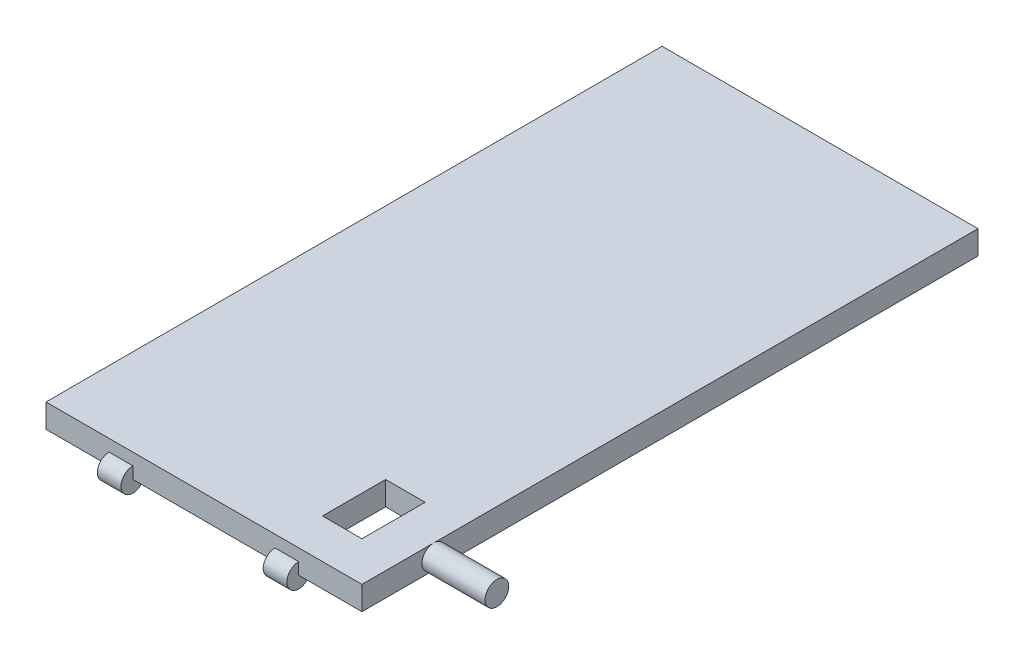
ISO-10303-21;
HEADER;
FILE_DESCRIPTION(('STEP AP214'),'2;1');
FILE_NAME('part.step','',(''),(''),'','','');
FILE_SCHEMA(('AUTOMOTIVE_DESIGN { 1 0 10303 214 1 1 1 1 }'));
ENDSEC;
DATA;
#1=APPLICATION_CONTEXT('core data for automotive mechanical design processes');
#2=APPLICATION_PROTOCOL_DEFINITION('international standard','automotive_design',2000,#1);
#3=PRODUCT_CONTEXT('',#1,'mechanical');
#4=PRODUCT('Part','Part','',(#3));
#5=PRODUCT_RELATED_PRODUCT_CATEGORY('part','',(#4));
#6=PRODUCT_DEFINITION_FORMATION('','',#4);
#7=PRODUCT_DEFINITION_CONTEXT('part definition',#1,'design');
#8=PRODUCT_DEFINITION('design','',#6,#7);
#9=PRODUCT_DEFINITION_SHAPE('','',#8);
#10=(LENGTH_UNIT() NAMED_UNIT(*) SI_UNIT(.MILLI.,.METRE.));
#11=(NAMED_UNIT(*) PLANE_ANGLE_UNIT() SI_UNIT($,.RADIAN.));
#12=(NAMED_UNIT(*) SI_UNIT($,.STERADIAN.) SOLID_ANGLE_UNIT());
#13=UNCERTAINTY_MEASURE_WITH_UNIT(LENGTH_MEASURE(1.E-05),#10,'distance_accuracy_value','');
#14=(GEOMETRIC_REPRESENTATION_CONTEXT(3) GLOBAL_UNCERTAINTY_ASSIGNED_CONTEXT((#13)) GLOBAL_UNIT_ASSIGNED_CONTEXT((#10,
#11,#12)) REPRESENTATION_CONTEXT('',''));
#15=CARTESIAN_POINT('',(0.,0.,0.));
#16=DIRECTION('',(0.,0.,1.));
#17=DIRECTION('',(1.,0.,0.));
#18=AXIS2_PLACEMENT_3D('',#15,#16,#17);
#19=CARTESIAN_POINT('',(40.,3.,0.));
#20=DIRECTION('',(-1.,0.,0.));
#21=DIRECTION('',(0.,0.,1.));
#22=AXIS2_PLACEMENT_3D('',#19,#20,#21);
#23=PLANE('',#22);
#24=CARTESIAN_POINT('',(40.,1.5,-9.09));
#25=DIRECTION('',(1.,0.,0.));
#26=DIRECTION('',(0.,0.,-1.));
#27=AXIS2_PLACEMENT_3D('',#24,#25,#26);
#28=CIRCLE('',#27,1.5);
#29=CARTESIAN_POINT('',(40.,3.,-9.09));
#30=VERTEX_POINT('',#29);
#31=CARTESIAN_POINT('',(40.,0.,-9.09));
#32=VERTEX_POINT('',#31);
#33=EDGE_CURVE('E43',#30,#32,#28,.T.);
#34=ORIENTED_EDGE('',*,*,#33,.F.);
#35=DIRECTION('',(0.,0.,-1.));
#36=VECTOR('',#35,1.);
#37=CARTESIAN_POINT('',(40.,3.,0.));
#38=LINE('',#37,#36);
#39=CARTESIAN_POINT('',(40.,3.,0.));
#40=VERTEX_POINT('',#39);
#41=EDGE_CURVE('E217',#40,#30,#38,.T.);
#42=ORIENTED_EDGE('',*,*,#41,.F.);
#43=DIRECTION('',(0.,-1.,0.));
#44=VECTOR('',#43,1.);
#45=CARTESIAN_POINT('',(40.,3.,0.));
#46=LINE('',#45,#44);
#47=CARTESIAN_POINT('',(40.,0.,0.));
#48=VERTEX_POINT('',#47);
#49=EDGE_CURVE('E239',#40,#48,#46,.T.);
#50=ORIENTED_EDGE('',*,*,#49,.T.);
#51=DIRECTION('',(0.,0.,-1.));
#52=VECTOR('',#51,1.);
#53=CARTESIAN_POINT('',(40.,0.,0.));
#54=LINE('',#53,#52);
#55=EDGE_CURVE('E230',#48,#32,#54,.T.);
#56=ORIENTED_EDGE('',*,*,#55,.T.);
#57=EDGE_LOOP('',(#34,#42,#50,#56));
#58=FACE_BOUND('',#57,.T.);
#59=ADVANCED_FACE('F33',(#58),#23,.F.);
#60=CARTESIAN_POINT('',(0.,3.,0.));
#61=DIRECTION('',(0.,0.,-1.));
#62=DIRECTION('',(-1.,0.,0.));
#63=AXIS2_PLACEMENT_3D('',#60,#61,#62);
#64=PLANE('',#63);
#65=DIRECTION('',(0.,-1.,0.));
#66=VECTOR('',#65,1.);
#67=CARTESIAN_POINT('',(8.,3.,0.));
#68=LINE('',#67,#66);
#69=CARTESIAN_POINT('',(8.,1.5,0.));
#70=VERTEX_POINT('',#69);
#71=CARTESIAN_POINT('',(8.,0.,0.));
#72=VERTEX_POINT('',#71);
#73=EDGE_CURVE('E190',#70,#72,#68,.T.);
#74=ORIENTED_EDGE('',*,*,#73,.F.);
#75=DIRECTION('',(1.,0.,0.));
#76=VECTOR('',#75,1.);
#77=CARTESIAN_POINT('',(8.,1.5,0.));
#78=LINE('',#77,#76);
#79=CARTESIAN_POINT('',(11.,1.5,0.));
#80=VERTEX_POINT('',#79);
#81=EDGE_CURVE('E193',#70,#80,#78,.T.);
#82=ORIENTED_EDGE('',*,*,#81,.T.);
#83=DIRECTION('',(0.,-1.,0.));
#84=VECTOR('',#83,1.);
#85=CARTESIAN_POINT('',(11.,3.,0.));
#86=LINE('',#85,#84);
#87=CARTESIAN_POINT('',(11.,0.,0.));
#88=VERTEX_POINT('',#87);
#89=EDGE_CURVE('E185',#80,#88,#86,.T.);
#90=ORIENTED_EDGE('',*,*,#89,.T.);
#91=DIRECTION('',(1.,0.,0.));
#92=VECTOR('',#91,1.);
#93=CARTESIAN_POINT('',(0.,0.,0.));
#94=LINE('',#93,#92);
#95=CARTESIAN_POINT('',(29.,0.,0.));
#96=VERTEX_POINT('',#95);
#97=EDGE_CURVE('E229',#88,#96,#94,.T.);
#98=ORIENTED_EDGE('',*,*,#97,.T.);
#99=DIRECTION('',(0.,-1.,0.));
#100=VECTOR('',#99,1.);
#101=CARTESIAN_POINT('',(29.,3.,0.));
#102=LINE('',#101,#100);
#103=CARTESIAN_POINT('',(29.,1.5,0.));
#104=VERTEX_POINT('',#103);
#105=EDGE_CURVE('E204',#104,#96,#102,.T.);
#106=ORIENTED_EDGE('',*,*,#105,.F.);
#107=DIRECTION('',(1.,0.,0.));
#108=VECTOR('',#107,1.);
#109=CARTESIAN_POINT('',(29.,1.5,0.));
#110=LINE('',#109,#108);
#111=CARTESIAN_POINT('',(32.,1.5,0.));
#112=VERTEX_POINT('',#111);
#113=EDGE_CURVE('E207',#104,#112,#110,.T.);
#114=ORIENTED_EDGE('',*,*,#113,.T.);
#115=DIRECTION('',(0.,-1.,0.));
#116=VECTOR('',#115,1.);
#117=CARTESIAN_POINT('',(32.,3.,0.));
#118=LINE('',#117,#116);
#119=CARTESIAN_POINT('',(32.,0.,0.));
#120=VERTEX_POINT('',#119);
#121=EDGE_CURVE('E199',#112,#120,#118,.T.);
#122=ORIENTED_EDGE('',*,*,#121,.T.);
#123=EDGE_CURVE('E224',#120,#48,#94,.T.);
#124=ORIENTED_EDGE('',*,*,#123,.T.);
#125=ORIENTED_EDGE('',*,*,#49,.F.);
#126=DIRECTION('',(1.,0.,0.));
#127=VECTOR('',#126,1.);
#128=CARTESIAN_POINT('',(0.,3.,0.));
#129=LINE('',#128,#127);
#130=CARTESIAN_POINT('',(0.,3.,0.));
#131=VERTEX_POINT('',#130);
#132=EDGE_CURVE('E213',#131,#40,#129,.T.);
#133=ORIENTED_EDGE('',*,*,#132,.F.);
#134=DIRECTION('',(0.,-1.,0.));
#135=VECTOR('',#134,1.);
#136=CARTESIAN_POINT('',(0.,3.,0.));
#137=LINE('',#136,#135);
#138=CARTESIAN_POINT('',(0.,0.,0.));
#139=VERTEX_POINT('',#138);
#140=EDGE_CURVE('E242',#131,#139,#137,.T.);
#141=ORIENTED_EDGE('',*,*,#140,.T.);
#142=EDGE_CURVE('E225',#139,#72,#94,.T.);
#143=ORIENTED_EDGE('',*,*,#142,.T.);
#144=EDGE_LOOP('',(#74,#82,#90,#98,#106,#114,#122,#124,#125,#133,#141,#143));
#145=FACE_BOUND('',#144,.T.);
#146=ADVANCED_FACE('F267',(#145),#64,.F.);
#147=CARTESIAN_POINT('',(0.,0.,0.));
#148=DIRECTION('',(0.,-1.,0.));
#149=DIRECTION('',(0.,0.,-1.));
#150=AXIS2_PLACEMENT_3D('',#147,#148,#149);
#151=PLANE('',#150);
#152=DIRECTION('',(0.,0.,1.));
#153=VECTOR('',#152,1.);
#154=CARTESIAN_POINT('',(35.,0.,0.));
#155=LINE('',#154,#153);
#156=CARTESIAN_POINT('',(35.,0.,-13.));
#157=VERTEX_POINT('',#156);
#158=CARTESIAN_POINT('',(35.,0.,-5.));
#159=VERTEX_POINT('',#158);
#160=EDGE_CURVE('E175',#157,#159,#155,.T.);
#161=ORIENTED_EDGE('',*,*,#160,.F.);
#162=DIRECTION('',(1.,0.,0.));
#163=VECTOR('',#162,1.);
#164=CARTESIAN_POINT('',(0.,0.,-13.));
#165=LINE('',#164,#163);
#166=CARTESIAN_POINT('',(30.,0.,-13.));
#167=VERTEX_POINT('',#166);
#168=EDGE_CURVE('E168',#167,#157,#165,.T.);
#169=ORIENTED_EDGE('',*,*,#168,.F.);
#170=DIRECTION('',(0.,0.,-1.));
#171=VECTOR('',#170,1.);
#172=CARTESIAN_POINT('',(30.,0.,0.));
#173=LINE('',#172,#171);
#174=CARTESIAN_POINT('',(30.,0.,-5.));
#175=VERTEX_POINT('',#174);
#176=EDGE_CURVE('E148',#175,#167,#173,.T.);
#177=ORIENTED_EDGE('',*,*,#176,.F.);
#178=DIRECTION('',(-1.,0.,0.));
#179=VECTOR('',#178,1.);
#180=CARTESIAN_POINT('',(0.,0.,-4.99999999999999));
#181=LINE('',#180,#179);
#182=EDGE_CURVE('E173',#159,#175,#181,.T.);
#183=ORIENTED_EDGE('',*,*,#182,.F.);
#184=EDGE_LOOP('',(#161,#169,#177,#183));
#185=FACE_BOUND('',#184,.T.);
#186=DIRECTION('',(1.,0.,0.));
#187=VECTOR('',#186,1.);
#188=CARTESIAN_POINT('',(8.,0.,-1.5));
#189=LINE('',#188,#187);
#190=CARTESIAN_POINT('',(8.,0.,-1.5));
#191=VERTEX_POINT('',#190);
#192=CARTESIAN_POINT('',(11.,0.,-1.5));
#193=VERTEX_POINT('',#192);
#194=EDGE_CURVE('E256',#191,#193,#189,.T.);
#195=ORIENTED_EDGE('',*,*,#194,.F.);
#196=DIRECTION('',(0.,0.,1.));
#197=VECTOR('',#196,1.);
#198=CARTESIAN_POINT('',(8.,0.,0.));
#199=LINE('',#198,#197);
#200=EDGE_CURVE('E37',#191,#72,#199,.T.);
#201=ORIENTED_EDGE('',*,*,#200,.T.);
#202=ORIENTED_EDGE('',*,*,#142,.F.);
#203=DIRECTION('',(0.,0.,1.));
#204=VECTOR('',#203,1.);
#205=CARTESIAN_POINT('',(0.,0.,0.));
#206=LINE('',#205,#204);
#207=CARTESIAN_POINT('',(0.,0.,-78.));
#208=VERTEX_POINT('',#207);
#209=EDGE_CURVE('E209',#208,#139,#206,.T.);
#210=ORIENTED_EDGE('',*,*,#209,.F.);
#211=DIRECTION('',(-1.,0.,0.));
#212=VECTOR('',#211,1.);
#213=CARTESIAN_POINT('',(0.,0.,-78.));
#214=LINE('',#213,#212);
#215=CARTESIAN_POINT('',(40.,0.,-78.));
#216=VERTEX_POINT('',#215);
#217=EDGE_CURVE('E214',#216,#208,#214,.T.);
#218=ORIENTED_EDGE('',*,*,#217,.F.);
#219=EDGE_CURVE('E228',#32,#216,#54,.T.);
#220=ORIENTED_EDGE('',*,*,#219,.F.);
#221=ORIENTED_EDGE('',*,*,#55,.F.);
#222=ORIENTED_EDGE('',*,*,#123,.F.);
#223=DIRECTION('',(0.,0.,1.));
#224=VECTOR('',#223,1.);
#225=CARTESIAN_POINT('',(32.,0.,0.));
#226=LINE('',#225,#224);
#227=CARTESIAN_POINT('',(32.,0.,-1.5));
#228=VERTEX_POINT('',#227);
#229=EDGE_CURVE('E245',#228,#120,#226,.T.);
#230=ORIENTED_EDGE('',*,*,#229,.F.);
#231=DIRECTION('',(1.,0.,0.));
#232=VECTOR('',#231,1.);
#233=CARTESIAN_POINT('',(29.,0.,-1.5));
#234=LINE('',#233,#232);
#235=CARTESIAN_POINT('',(29.,0.,-1.5));
#236=VERTEX_POINT('',#235);
#237=EDGE_CURVE('E248',#236,#228,#234,.T.);
#238=ORIENTED_EDGE('',*,*,#237,.F.);
#239=DIRECTION('',(0.,0.,1.));
#240=VECTOR('',#239,1.);
#241=CARTESIAN_POINT('',(29.,0.,0.));
#242=LINE('',#241,#240);
#243=EDGE_CURVE('E251',#236,#96,#242,.T.);
#244=ORIENTED_EDGE('',*,*,#243,.T.);
#245=ORIENTED_EDGE('',*,*,#97,.F.);
#246=DIRECTION('',(0.,0.,1.));
#247=VECTOR('',#246,1.);
#248=CARTESIAN_POINT('',(11.,0.,0.));
#249=LINE('',#248,#247);
#250=EDGE_CURVE('E254',#193,#88,#249,.T.);
#251=ORIENTED_EDGE('',*,*,#250,.F.);
#252=EDGE_LOOP('',(#195,#201,#202,#210,#218,#220,#221,#222,#230,#238,#244,#245,#251));
#253=FACE_BOUND('',#252,.T.);
#254=ADVANCED_FACE('F262',(#185,#253),#151,.T.);
#255=CARTESIAN_POINT('',(0.,3.,0.));
#256=DIRECTION('',(1.,0.,0.));
#257=DIRECTION('',(0.,0.,-1.));
#258=AXIS2_PLACEMENT_3D('',#255,#256,#257);
#259=PLANE('',#258);
#260=ORIENTED_EDGE('',*,*,#209,.T.);
#261=ORIENTED_EDGE('',*,*,#140,.F.);
#262=DIRECTION('',(0.,0.,1.));
#263=VECTOR('',#262,1.);
#264=CARTESIAN_POINT('',(0.,3.,0.));
#265=LINE('',#264,#263);
#266=CARTESIAN_POINT('',(0.,3.,-78.));
#267=VERTEX_POINT('',#266);
#268=EDGE_CURVE('E210',#267,#131,#265,.T.);
#269=ORIENTED_EDGE('',*,*,#268,.F.);
#270=DIRECTION('',(0.,-1.,0.));
#271=VECTOR('',#270,1.);
#272=CARTESIAN_POINT('',(0.,3.,-78.));
#273=LINE('',#272,#271);
#274=EDGE_CURVE('E221',#267,#208,#273,.T.);
#275=ORIENTED_EDGE('',*,*,#274,.T.);
#276=EDGE_LOOP('',(#260,#261,#269,#275));
#277=FACE_BOUND('',#276,.T.);
#278=ADVANCED_FACE('F35',(#277),#259,.F.);
#279=EDGE_CURVE('E11',#32,#30,#28,.T.);
#280=ORIENTED_EDGE('',*,*,#279,.F.);
#281=ORIENTED_EDGE('',*,*,#219,.T.);
#282=DIRECTION('',(0.,-1.,0.));
#283=VECTOR('',#282,1.);
#284=CARTESIAN_POINT('',(40.,3.,-78.));
#285=LINE('',#284,#283);
#286=CARTESIAN_POINT('',(40.,3.,-78.));
#287=VERTEX_POINT('',#286);
#288=EDGE_CURVE('E236',#287,#216,#285,.T.);
#289=ORIENTED_EDGE('',*,*,#288,.F.);
#290=EDGE_CURVE('E216',#30,#287,#38,.T.);
#291=ORIENTED_EDGE('',*,*,#290,.F.);
#292=EDGE_LOOP('',(#280,#281,#289,#291));
#293=FACE_BOUND('',#292,.T.);
#294=ADVANCED_FACE('F286',(#293),#23,.F.);
#295=CARTESIAN_POINT('',(0.,3.,-78.));
#296=DIRECTION('',(0.,0.,1.));
#297=DIRECTION('',(1.,0.,0.));
#298=AXIS2_PLACEMENT_3D('',#295,#296,#297);
#299=PLANE('',#298);
#300=ORIENTED_EDGE('',*,*,#217,.T.);
#301=ORIENTED_EDGE('',*,*,#274,.F.);
#302=DIRECTION('',(-1.,0.,0.));
#303=VECTOR('',#302,1.);
#304=CARTESIAN_POINT('',(0.,3.,-78.));
#305=LINE('',#304,#303);
#306=EDGE_CURVE('E219',#287,#267,#305,.T.);
#307=ORIENTED_EDGE('',*,*,#306,.F.);
#308=ORIENTED_EDGE('',*,*,#288,.T.);
#309=EDGE_LOOP('',(#300,#301,#307,#308));
#310=FACE_BOUND('',#309,.T.);
#311=ADVANCED_FACE('F290',(#310),#299,.F.);
#312=CARTESIAN_POINT('',(0.,3.,0.));
#313=DIRECTION('',(0.,-1.,0.));
#314=DIRECTION('',(0.,0.,-1.));
#315=AXIS2_PLACEMENT_3D('',#312,#313,#314);
#316=PLANE('',#315);
#317=DIRECTION('',(-1.,0.,0.));
#318=VECTOR('',#317,1.);
#319=CARTESIAN_POINT('',(35.,3.,-13.));
#320=LINE('',#319,#318);
#321=CARTESIAN_POINT('',(35.,3.,-13.));
#322=VERTEX_POINT('',#321);
#323=CARTESIAN_POINT('',(30.,3.,-13.));
#324=VERTEX_POINT('',#323);
#325=EDGE_CURVE('E154',#322,#324,#320,.T.);
#326=ORIENTED_EDGE('',*,*,#325,.F.);
#327=DIRECTION('',(0.,0.,-1.));
#328=VECTOR('',#327,1.);
#329=CARTESIAN_POINT('',(35.,3.,-5.));
#330=LINE('',#329,#328);
#331=CARTESIAN_POINT('',(35.,3.,-5.));
#332=VERTEX_POINT('',#331);
#333=EDGE_CURVE('E58',#332,#322,#330,.T.);
#334=ORIENTED_EDGE('',*,*,#333,.F.);
#335=DIRECTION('',(1.,0.,0.));
#336=VECTOR('',#335,1.);
#337=CARTESIAN_POINT('',(35.,3.,-5.));
#338=LINE('',#337,#336);
#339=CARTESIAN_POINT('',(30.,3.,-5.));
#340=VERTEX_POINT('',#339);
#341=EDGE_CURVE('E161',#340,#332,#338,.T.);
#342=ORIENTED_EDGE('',*,*,#341,.F.);
#343=DIRECTION('',(0.,0.,1.));
#344=VECTOR('',#343,1.);
#345=CARTESIAN_POINT('',(30.,3.,-5.));
#346=LINE('',#345,#344);
#347=EDGE_CURVE('E145',#324,#340,#346,.T.);
#348=ORIENTED_EDGE('',*,*,#347,.F.);
#349=EDGE_LOOP('',(#326,#334,#342,#348));
#350=FACE_BOUND('',#349,.T.);
#351=ORIENTED_EDGE('',*,*,#268,.T.);
#352=ORIENTED_EDGE('',*,*,#132,.T.);
#353=ORIENTED_EDGE('',*,*,#41,.T.);
#354=ORIENTED_EDGE('',*,*,#290,.T.);
#355=ORIENTED_EDGE('',*,*,#306,.T.);
#356=EDGE_LOOP('',(#351,#352,#353,#354,#355));
#357=FACE_BOUND('',#356,.T.);
#358=ADVANCED_FACE('F158',(#350,#357),#316,.F.);
#359=CARTESIAN_POINT('',(29.,0.,0.));
#360=DIRECTION('',(1.,0.,0.));
#361=DIRECTION('',(0.,0.,-1.));
#362=AXIS2_PLACEMENT_3D('',#359,#360,#361);
#363=CYLINDRICAL_SURFACE('',#362,1.5);
#364=ORIENTED_EDGE('',*,*,#113,.F.);
#365=CARTESIAN_POINT('',(29.,0.,0.));
#366=DIRECTION('',(1.,0.,0.));
#367=DIRECTION('',(0.,0.,-1.));
#368=AXIS2_PLACEMENT_3D('',#365,#366,#367);
#369=CIRCLE('',#368,1.5);
#370=EDGE_CURVE('E196',#104,#236,#369,.T.);
#371=ORIENTED_EDGE('',*,*,#370,.T.);
#372=ORIENTED_EDGE('',*,*,#237,.T.);
#373=CARTESIAN_POINT('',(32.,0.,0.));
#374=DIRECTION('',(1.,0.,0.));
#375=DIRECTION('',(0.,0.,-1.));
#376=AXIS2_PLACEMENT_3D('',#373,#374,#375);
#377=CIRCLE('',#376,1.5);
#378=EDGE_CURVE('E195',#112,#228,#377,.T.);
#379=ORIENTED_EDGE('',*,*,#378,.F.);
#380=EDGE_LOOP('',(#364,#371,#372,#379));
#381=FACE_BOUND('',#380,.T.);
#382=ADVANCED_FACE('F332',(#381),#363,.T.);
#383=CARTESIAN_POINT('',(29.,0.,0.));
#384=DIRECTION('',(1.,0.,0.));
#385=DIRECTION('',(0.,0.,-1.));
#386=AXIS2_PLACEMENT_3D('',#383,#384,#385);
#387=PLANE('',#386);
#388=ORIENTED_EDGE('',*,*,#370,.F.);
#389=ORIENTED_EDGE('',*,*,#105,.T.);
#390=ORIENTED_EDGE('',*,*,#243,.F.);
#391=EDGE_LOOP('',(#388,#389,#390));
#392=FACE_BOUND('',#391,.T.);
#393=ADVANCED_FACE('F335',(#392),#387,.F.);
#394=CARTESIAN_POINT('',(32.,0.,0.));
#395=DIRECTION('',(1.,0.,0.));
#396=DIRECTION('',(0.,0.,-1.));
#397=AXIS2_PLACEMENT_3D('',#394,#395,#396);
#398=PLANE('',#397);
#399=ORIENTED_EDGE('',*,*,#121,.F.);
#400=ORIENTED_EDGE('',*,*,#378,.T.);
#401=ORIENTED_EDGE('',*,*,#229,.T.);
#402=EDGE_LOOP('',(#399,#400,#401));
#403=FACE_BOUND('',#402,.T.);
#404=ADVANCED_FACE('F337',(#403),#398,.T.);
#405=CARTESIAN_POINT('',(8.,0.,0.));
#406=DIRECTION('',(1.,0.,0.));
#407=DIRECTION('',(0.,0.,-1.));
#408=AXIS2_PLACEMENT_3D('',#405,#406,#407);
#409=CYLINDRICAL_SURFACE('',#408,1.5);
#410=ORIENTED_EDGE('',*,*,#81,.F.);
#411=CARTESIAN_POINT('',(8.,0.,0.));
#412=DIRECTION('',(1.,0.,0.));
#413=DIRECTION('',(0.,0.,-1.));
#414=AXIS2_PLACEMENT_3D('',#411,#412,#413);
#415=CIRCLE('',#414,1.5);
#416=EDGE_CURVE('E182',#70,#191,#415,.T.);
#417=ORIENTED_EDGE('',*,*,#416,.T.);
#418=ORIENTED_EDGE('',*,*,#194,.T.);
#419=CARTESIAN_POINT('',(11.,0.,0.));
#420=DIRECTION('',(1.,0.,0.));
#421=DIRECTION('',(0.,0.,-1.));
#422=AXIS2_PLACEMENT_3D('',#419,#420,#421);
#423=CIRCLE('',#422,1.5);
#424=EDGE_CURVE('E179',#80,#193,#423,.T.);
#425=ORIENTED_EDGE('',*,*,#424,.F.);
#426=EDGE_LOOP('',(#410,#417,#418,#425));
#427=FACE_BOUND('',#426,.T.);
#428=ADVANCED_FACE('F271',(#427),#409,.T.);
#429=CARTESIAN_POINT('',(8.,0.,0.));
#430=DIRECTION('',(1.,0.,0.));
#431=DIRECTION('',(0.,0.,-1.));
#432=AXIS2_PLACEMENT_3D('',#429,#430,#431);
#433=PLANE('',#432);
#434=ORIENTED_EDGE('',*,*,#416,.F.);
#435=ORIENTED_EDGE('',*,*,#73,.T.);
#436=ORIENTED_EDGE('',*,*,#200,.F.);
#437=EDGE_LOOP('',(#434,#435,#436));
#438=FACE_BOUND('',#437,.T.);
#439=ADVANCED_FACE('F270',(#438),#433,.F.);
#440=CARTESIAN_POINT('',(11.,0.,0.));
#441=DIRECTION('',(1.,0.,0.));
#442=DIRECTION('',(0.,0.,-1.));
#443=AXIS2_PLACEMENT_3D('',#440,#441,#442);
#444=PLANE('',#443);
#445=ORIENTED_EDGE('',*,*,#89,.F.);
#446=ORIENTED_EDGE('',*,*,#424,.T.);
#447=ORIENTED_EDGE('',*,*,#250,.T.);
#448=EDGE_LOOP('',(#445,#446,#447));
#449=FACE_BOUND('',#448,.T.);
#450=ADVANCED_FACE('F274',(#449),#444,.T.);
#451=CARTESIAN_POINT('',(48.,1.5,-9.09));
#452=DIRECTION('',(-1.,0.,0.));
#453=DIRECTION('',(0.,0.,1.));
#454=AXIS2_PLACEMENT_3D('',#451,#452,#453);
#455=CYLINDRICAL_SURFACE('',#454,1.5);
#456=CARTESIAN_POINT('',(48.,1.5,-9.09));
#457=DIRECTION('',(1.,0.,0.));
#458=DIRECTION('',(0.,0.,-1.));
#459=AXIS2_PLACEMENT_3D('',#456,#457,#458);
#460=CIRCLE('',#459,1.5);
#461=CARTESIAN_POINT('',(48.,1.5,-10.59));
#462=VERTEX_POINT('',#461);
#463=EDGE_CURVE('E177',#462,#462,#460,.T.);
#464=ORIENTED_EDGE('',*,*,#463,.F.);
#465=EDGE_LOOP('',(#464));
#466=FACE_BOUND('',#465,.T.);
#467=ORIENTED_EDGE('',*,*,#33,.T.);
#468=ORIENTED_EDGE('',*,*,#279,.T.);
#469=EDGE_LOOP('',(#467,#468));
#470=FACE_BOUND('',#469,.T.);
#471=ADVANCED_FACE('F294',(#466,#470),#455,.T.);
#472=CARTESIAN_POINT('',(48.,1.5,-9.09));
#473=DIRECTION('',(1.,0.,0.));
#474=DIRECTION('',(0.,0.,-1.));
#475=AXIS2_PLACEMENT_3D('',#472,#473,#474);
#476=PLANE('',#475);
#477=ORIENTED_EDGE('',*,*,#463,.T.);
#478=EDGE_LOOP('',(#477));
#479=FACE_BOUND('',#478,.T.);
#480=ADVANCED_FACE('F296',(#479),#476,.T.);
#481=CARTESIAN_POINT('',(35.,-2.,-5.));
#482=DIRECTION('',(1.,0.,0.));
#483=DIRECTION('',(0.,0.,-1.));
#484=AXIS2_PLACEMENT_3D('',#481,#482,#483);
#485=PLANE('',#484);
#486=ORIENTED_EDGE('',*,*,#160,.T.);
#487=DIRECTION('',(0.,1.,0.));
#488=VECTOR('',#487,1.);
#489=CARTESIAN_POINT('',(35.,-2.,-5.));
#490=LINE('',#489,#488);
#491=EDGE_CURVE('E166',#159,#332,#490,.T.);
#492=ORIENTED_EDGE('',*,*,#491,.T.);
#493=ORIENTED_EDGE('',*,*,#333,.T.);
#494=DIRECTION('',(0.,1.,0.));
#495=VECTOR('',#494,1.);
#496=CARTESIAN_POINT('',(35.,-2.,-13.));
#497=LINE('',#496,#495);
#498=EDGE_CURVE('E151',#157,#322,#497,.T.);
#499=ORIENTED_EDGE('',*,*,#498,.F.);
#500=EDGE_LOOP('',(#486,#492,#493,#499));
#501=FACE_BOUND('',#500,.T.);
#502=ADVANCED_FACE('F303',(#501),#485,.F.);
#503=CARTESIAN_POINT('',(35.,-2.,-5.));
#504=DIRECTION('',(0.,0.,1.));
#505=DIRECTION('',(1.,0.,0.));
#506=AXIS2_PLACEMENT_3D('',#503,#504,#505);
#507=PLANE('',#506);
#508=ORIENTED_EDGE('',*,*,#182,.T.);
#509=DIRECTION('',(0.,1.,0.));
#510=VECTOR('',#509,1.);
#511=CARTESIAN_POINT('',(30.,-2.,-5.));
#512=LINE('',#511,#510);
#513=EDGE_CURVE('E150',#175,#340,#512,.T.);
#514=ORIENTED_EDGE('',*,*,#513,.T.);
#515=ORIENTED_EDGE('',*,*,#341,.T.);
#516=ORIENTED_EDGE('',*,*,#491,.F.);
#517=EDGE_LOOP('',(#508,#514,#515,#516));
#518=FACE_BOUND('',#517,.T.);
#519=ADVANCED_FACE('F396',(#518),#507,.F.);
#520=CARTESIAN_POINT('',(30.,-2.,-5.));
#521=DIRECTION('',(-1.,0.,0.));
#522=DIRECTION('',(0.,0.,1.));
#523=AXIS2_PLACEMENT_3D('',#520,#521,#522);
#524=PLANE('',#523);
#525=ORIENTED_EDGE('',*,*,#176,.T.);
#526=DIRECTION('',(0.,1.,0.));
#527=VECTOR('',#526,1.);
#528=CARTESIAN_POINT('',(30.,-2.,-13.));
#529=LINE('',#528,#527);
#530=EDGE_CURVE('E50',#167,#324,#529,.T.);
#531=ORIENTED_EDGE('',*,*,#530,.T.);
#532=ORIENTED_EDGE('',*,*,#347,.T.);
#533=ORIENTED_EDGE('',*,*,#513,.F.);
#534=EDGE_LOOP('',(#525,#531,#532,#533));
#535=FACE_BOUND('',#534,.T.);
#536=ADVANCED_FACE('F142',(#535),#524,.F.);
#537=CARTESIAN_POINT('',(35.,-2.,-13.));
#538=DIRECTION('',(0.,0.,-1.));
#539=DIRECTION('',(-1.,0.,0.));
#540=AXIS2_PLACEMENT_3D('',#537,#538,#539);
#541=PLANE('',#540);
#542=ORIENTED_EDGE('',*,*,#168,.T.);
#543=ORIENTED_EDGE('',*,*,#498,.T.);
#544=ORIENTED_EDGE('',*,*,#325,.T.);
#545=ORIENTED_EDGE('',*,*,#530,.F.);
#546=EDGE_LOOP('',(#542,#543,#544,#545));
#547=FACE_BOUND('',#546,.T.);
#548=ADVANCED_FACE('F155',(#547),#541,.F.);
#549=CLOSED_SHELL('',(#59,#146,#254,#278,#294,#311,#358,#382,#393,#404,#428,#439,#450,#471,#480,
#502,#519,#536,#548));
#550=MANIFOLD_SOLID_BREP('B2',#549);
#551=ADVANCED_BREP_SHAPE_REPRESENTATION('',(#18,#550),#14);
#552=SHAPE_DEFINITION_REPRESENTATION(#9,#551);
ENDSEC;
END-ISO-10303-21;
